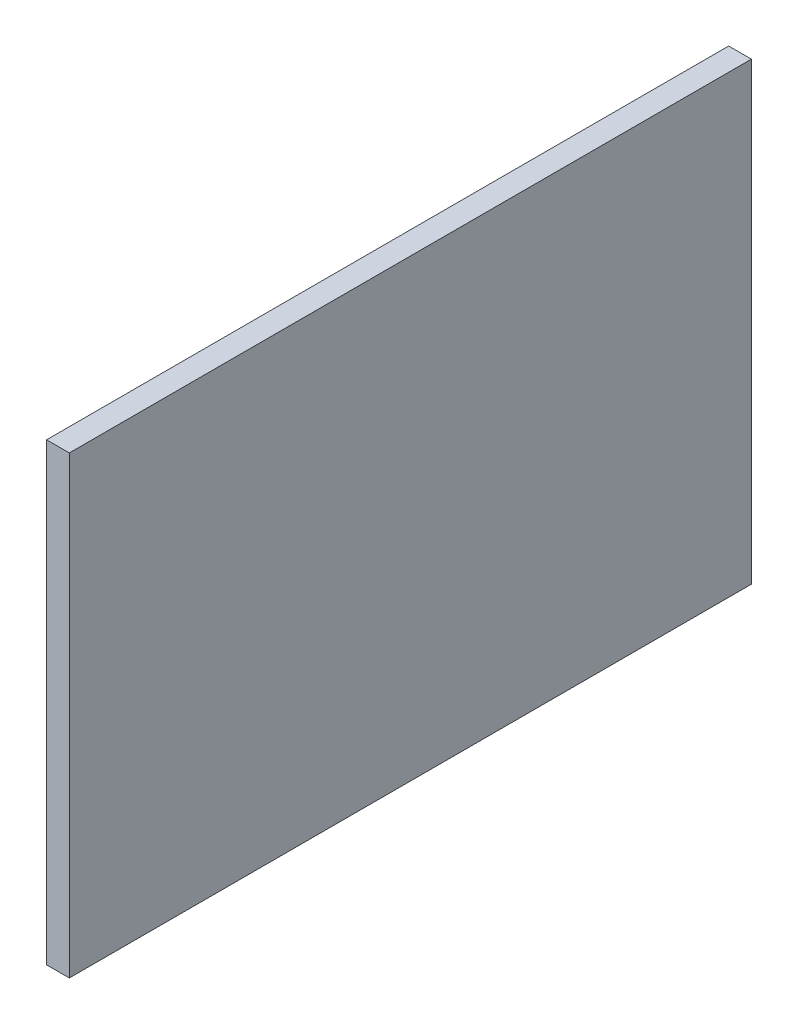
ISO-10303-21;
HEADER;
FILE_DESCRIPTION(('STEP AP214'),'2;1');
FILE_NAME('part.step','',(''),(''),'','','');
FILE_SCHEMA(('AUTOMOTIVE_DESIGN { 1 0 10303 214 1 1 1 1 }'));
ENDSEC;
DATA;
#1=APPLICATION_CONTEXT('core data for automotive mechanical design processes');
#2=APPLICATION_PROTOCOL_DEFINITION('international standard','automotive_design',2000,#1);
#3=PRODUCT_CONTEXT('',#1,'mechanical');
#4=PRODUCT('Part','Part','',(#3));
#5=PRODUCT_RELATED_PRODUCT_CATEGORY('part','',(#4));
#6=PRODUCT_DEFINITION_FORMATION('','',#4);
#7=PRODUCT_DEFINITION_CONTEXT('part definition',#1,'design');
#8=PRODUCT_DEFINITION('design','',#6,#7);
#9=PRODUCT_DEFINITION_SHAPE('','',#8);
#10=(LENGTH_UNIT() NAMED_UNIT(*) SI_UNIT(.MILLI.,.METRE.));
#11=(NAMED_UNIT(*) PLANE_ANGLE_UNIT() SI_UNIT($,.RADIAN.));
#12=(NAMED_UNIT(*) SI_UNIT($,.STERADIAN.) SOLID_ANGLE_UNIT());
#13=UNCERTAINTY_MEASURE_WITH_UNIT(LENGTH_MEASURE(1.E-05),#10,'distance_accuracy_value','');
#14=(GEOMETRIC_REPRESENTATION_CONTEXT(3) GLOBAL_UNCERTAINTY_ASSIGNED_CONTEXT((#13)) GLOBAL_UNIT_ASSIGNED_CONTEXT((#10,
#11,#12)) REPRESENTATION_CONTEXT('',''));
#15=CARTESIAN_POINT('',(0.,0.,0.));
#16=DIRECTION('',(0.,0.,1.));
#17=DIRECTION('',(1.,0.,0.));
#18=AXIS2_PLACEMENT_3D('',#15,#16,#17);
#19=CARTESIAN_POINT('',(0.,0.,300.));
#20=DIRECTION('',(1.,0.,0.));
#21=DIRECTION('',(0.,0.,-1.));
#22=AXIS2_PLACEMENT_3D('',#19,#20,#21);
#23=PLANE('',#22);
#24=DIRECTION('',(0.,-1.,0.));
#25=VECTOR('',#24,1.);
#26=CARTESIAN_POINT('',(0.,0.,0.));
#27=LINE('',#26,#25);
#28=CARTESIAN_POINT('',(0.,200.,0.));
#29=VERTEX_POINT('',#28);
#30=CARTESIAN_POINT('',(0.,0.,0.));
#31=VERTEX_POINT('',#30);
#32=EDGE_CURVE('E95',#29,#31,#27,.T.);
#33=ORIENTED_EDGE('',*,*,#32,.T.);
#34=DIRECTION('',(0.,0.,-1.));
#35=VECTOR('',#34,1.);
#36=CARTESIAN_POINT('',(0.,0.,300.));
#37=LINE('',#36,#35);
#38=CARTESIAN_POINT('',(0.,0.,300.));
#39=VERTEX_POINT('',#38);
#40=EDGE_CURVE('E11',#39,#31,#37,.T.);
#41=ORIENTED_EDGE('',*,*,#40,.F.);
#42=DIRECTION('',(0.,-1.,0.));
#43=VECTOR('',#42,1.);
#44=CARTESIAN_POINT('',(0.,0.,300.));
#45=LINE('',#44,#43);
#46=CARTESIAN_POINT('',(0.,200.,300.));
#47=VERTEX_POINT('',#46);
#48=EDGE_CURVE('E83',#47,#39,#45,.T.);
#49=ORIENTED_EDGE('',*,*,#48,.F.);
#50=DIRECTION('',(0.,0.,-1.));
#51=VECTOR('',#50,1.);
#52=CARTESIAN_POINT('',(0.,200.,300.));
#53=LINE('',#52,#51);
#54=EDGE_CURVE('E91',#47,#29,#53,.T.);
#55=ORIENTED_EDGE('',*,*,#54,.T.);
#56=EDGE_LOOP('',(#33,#41,#49,#55));
#57=FACE_BOUND('',#56,.T.);
#58=ADVANCED_FACE('F32',(#57),#23,.F.);
#59=CARTESIAN_POINT('',(0.,0.,300.));
#60=DIRECTION('',(0.,1.,0.));
#61=DIRECTION('',(0.,0.,1.));
#62=AXIS2_PLACEMENT_3D('',#59,#60,#61);
#63=PLANE('',#62);
#64=DIRECTION('',(1.,0.,0.));
#65=VECTOR('',#64,1.);
#66=CARTESIAN_POINT('',(0.,0.,0.));
#67=LINE('',#66,#65);
#68=CARTESIAN_POINT('',(10.,0.,0.));
#69=VERTEX_POINT('',#68);
#70=EDGE_CURVE('E87',#31,#69,#67,.T.);
#71=ORIENTED_EDGE('',*,*,#70,.T.);
#72=DIRECTION('',(0.,0.,-1.));
#73=VECTOR('',#72,1.);
#74=CARTESIAN_POINT('',(10.,0.,300.));
#75=LINE('',#74,#73);
#76=CARTESIAN_POINT('',(10.,0.,300.));
#77=VERTEX_POINT('',#76);
#78=EDGE_CURVE('E40',#77,#69,#75,.T.);
#79=ORIENTED_EDGE('',*,*,#78,.F.);
#80=DIRECTION('',(1.,0.,0.));
#81=VECTOR('',#80,1.);
#82=CARTESIAN_POINT('',(0.,0.,300.));
#83=LINE('',#82,#81);
#84=EDGE_CURVE('E78',#39,#77,#83,.T.);
#85=ORIENTED_EDGE('',*,*,#84,.F.);
#86=ORIENTED_EDGE('',*,*,#40,.T.);
#87=EDGE_LOOP('',(#71,#79,#85,#86));
#88=FACE_BOUND('',#87,.T.);
#89=ADVANCED_FACE('F86',(#88),#63,.F.);
#90=CARTESIAN_POINT('',(10.,0.,300.));
#91=DIRECTION('',(-1.,0.,0.));
#92=DIRECTION('',(0.,-1.,0.));
#93=AXIS2_PLACEMENT_3D('',#90,#91,#92);
#94=PLANE('',#93);
#95=DIRECTION('',(0.,1.,0.));
#96=VECTOR('',#95,1.);
#97=CARTESIAN_POINT('',(10.,0.,0.));
#98=LINE('',#97,#96);
#99=CARTESIAN_POINT('',(10.,200.,0.));
#100=VERTEX_POINT('',#99);
#101=EDGE_CURVE('E65',#69,#100,#98,.T.);
#102=ORIENTED_EDGE('',*,*,#101,.T.);
#103=DIRECTION('',(0.,0.,-1.));
#104=VECTOR('',#103,1.);
#105=CARTESIAN_POINT('',(10.,200.,300.));
#106=LINE('',#105,#104);
#107=CARTESIAN_POINT('',(10.,200.,300.));
#108=VERTEX_POINT('',#107);
#109=EDGE_CURVE('E88',#108,#100,#106,.T.);
#110=ORIENTED_EDGE('',*,*,#109,.F.);
#111=DIRECTION('',(0.,1.,0.));
#112=VECTOR('',#111,1.);
#113=CARTESIAN_POINT('',(10.,0.,300.));
#114=LINE('',#113,#112);
#115=EDGE_CURVE('E81',#77,#108,#114,.T.);
#116=ORIENTED_EDGE('',*,*,#115,.F.);
#117=ORIENTED_EDGE('',*,*,#78,.T.);
#118=EDGE_LOOP('',(#102,#110,#116,#117));
#119=FACE_BOUND('',#118,.T.);
#120=ADVANCED_FACE('F89',(#119),#94,.F.);
#121=CARTESIAN_POINT('',(0.,200.,300.));
#122=DIRECTION('',(0.,-1.,0.));
#123=DIRECTION('',(0.,0.,-1.));
#124=AXIS2_PLACEMENT_3D('',#121,#122,#123);
#125=PLANE('',#124);
#126=DIRECTION('',(-1.,0.,0.));
#127=VECTOR('',#126,1.);
#128=CARTESIAN_POINT('',(0.,200.,0.));
#129=LINE('',#128,#127);
#130=EDGE_CURVE('E71',#100,#29,#129,.T.);
#131=ORIENTED_EDGE('',*,*,#130,.T.);
#132=ORIENTED_EDGE('',*,*,#54,.F.);
#133=DIRECTION('',(-1.,0.,0.));
#134=VECTOR('',#133,1.);
#135=CARTESIAN_POINT('',(0.,200.,300.));
#136=LINE('',#135,#134);
#137=EDGE_CURVE('E48',#108,#47,#136,.T.);
#138=ORIENTED_EDGE('',*,*,#137,.F.);
#139=ORIENTED_EDGE('',*,*,#109,.T.);
#140=EDGE_LOOP('',(#131,#132,#138,#139));
#141=FACE_BOUND('',#140,.T.);
#142=ADVANCED_FACE('F102',(#141),#125,.F.);
#143=CARTESIAN_POINT('',(0.,0.,300.));
#144=DIRECTION('',(0.,0.,-1.));
#145=DIRECTION('',(-1.,0.,0.));
#146=AXIS2_PLACEMENT_3D('',#143,#144,#145);
#147=PLANE('',#146);
#148=ORIENTED_EDGE('',*,*,#48,.T.);
#149=ORIENTED_EDGE('',*,*,#84,.T.);
#150=ORIENTED_EDGE('',*,*,#115,.T.);
#151=ORIENTED_EDGE('',*,*,#137,.T.);
#152=EDGE_LOOP('',(#148,#149,#150,#151));
#153=FACE_BOUND('',#152,.T.);
#154=ADVANCED_FACE('F79',(#153),#147,.F.);
#155=CARTESIAN_POINT('',(0.,0.,0.));
#156=DIRECTION('',(0.,0.,-1.));
#157=DIRECTION('',(-1.,0.,0.));
#158=AXIS2_PLACEMENT_3D('',#155,#156,#157);
#159=PLANE('',#158);
#160=ORIENTED_EDGE('',*,*,#32,.F.);
#161=ORIENTED_EDGE('',*,*,#130,.F.);
#162=ORIENTED_EDGE('',*,*,#101,.F.);
#163=ORIENTED_EDGE('',*,*,#70,.F.);
#164=EDGE_LOOP('',(#160,#161,#162,#163));
#165=FACE_BOUND('',#164,.T.);
#166=ADVANCED_FACE('F105',(#165),#159,.T.);
#167=CLOSED_SHELL('',(#58,#89,#120,#142,#154,#166));
#168=MANIFOLD_SOLID_BREP('B2',#167);
#169=ADVANCED_BREP_SHAPE_REPRESENTATION('',(#18,#168),#14);
#170=SHAPE_DEFINITION_REPRESENTATION(#9,#169);
ENDSEC;
END-ISO-10303-21;
